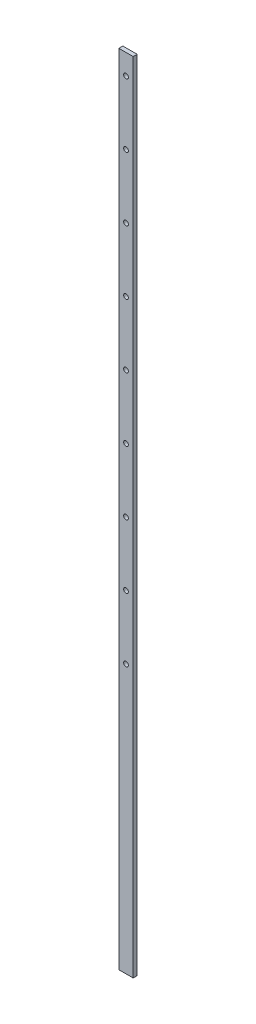
ISO-10303-21;
HEADER;
FILE_DESCRIPTION(('STEP AP214'),'2;1');
FILE_NAME('part.step','',(''),(''),'','','');
FILE_SCHEMA(('AUTOMOTIVE_DESIGN { 1 0 10303 214 1 1 1 1 }'));
ENDSEC;
DATA;
#1=APPLICATION_CONTEXT('core data for automotive mechanical design processes');
#2=APPLICATION_PROTOCOL_DEFINITION('international standard','automotive_design',2000,#1);
#3=PRODUCT_CONTEXT('',#1,'mechanical');
#4=PRODUCT('Part','Part','',(#3));
#5=PRODUCT_RELATED_PRODUCT_CATEGORY('part','',(#4));
#6=PRODUCT_DEFINITION_FORMATION('','',#4);
#7=PRODUCT_DEFINITION_CONTEXT('part definition',#1,'design');
#8=PRODUCT_DEFINITION('design','',#6,#7);
#9=PRODUCT_DEFINITION_SHAPE('','',#8);
#10=(LENGTH_UNIT() NAMED_UNIT(*) SI_UNIT(.MILLI.,.METRE.));
#11=(NAMED_UNIT(*) PLANE_ANGLE_UNIT() SI_UNIT($,.RADIAN.));
#12=(NAMED_UNIT(*) SI_UNIT($,.STERADIAN.) SOLID_ANGLE_UNIT());
#13=UNCERTAINTY_MEASURE_WITH_UNIT(LENGTH_MEASURE(1.E-05),#10,'distance_accuracy_value','');
#14=(GEOMETRIC_REPRESENTATION_CONTEXT(3) GLOBAL_UNCERTAINTY_ASSIGNED_CONTEXT((#13)) GLOBAL_UNIT_ASSIGNED_CONTEXT((#10,
#11,#12)) REPRESENTATION_CONTEXT('',''));
#15=CARTESIAN_POINT('',(0.,0.,0.));
#16=DIRECTION('',(0.,0.,1.));
#17=DIRECTION('',(1.,0.,0.));
#18=AXIS2_PLACEMENT_3D('',#15,#16,#17);
#19=CARTESIAN_POINT('',(0.,-164.18,-1.11022302462516E-13));
#20=DIRECTION('',(0.,0.,1.));
#21=DIRECTION('',(1.,0.,0.));
#22=AXIS2_PLACEMENT_3D('',#19,#20,#21);
#23=CYLINDRICAL_SURFACE('',#22,3.);
#24=CARTESIAN_POINT('',(0.,-164.18,-1.11022302462516E-13));
#25=DIRECTION('',(0.,0.,1.));
#26=DIRECTION('',(1.,0.,0.));
#27=AXIS2_PLACEMENT_3D('',#24,#25,#26);
#28=CIRCLE('',#27,3.);
#29=CARTESIAN_POINT('',(3.00000000000001,-164.18,-1.11001485780804E-13));
#30=VERTEX_POINT('',#29);
#31=EDGE_CURVE('E49',#30,#30,#28,.T.);
#32=ORIENTED_EDGE('',*,*,#31,.F.);
#33=EDGE_LOOP('',(#32));
#34=FACE_BOUND('',#33,.T.);
#35=CARTESIAN_POINT('',(0.,-164.18,4.99999999999989));
#36=DIRECTION('',(0.,0.,1.));
#37=DIRECTION('',(1.,0.,0.));
#38=AXIS2_PLACEMENT_3D('',#35,#36,#37);
#39=CIRCLE('',#38,3.);
#40=CARTESIAN_POINT('',(3.,-164.18,4.99999999999989));
#41=VERTEX_POINT('',#40);
#42=EDGE_CURVE('E11',#41,#41,#39,.T.);
#43=ORIENTED_EDGE('',*,*,#42,.T.);
#44=EDGE_LOOP('',(#43));
#45=FACE_BOUND('',#44,.T.);
#46=ADVANCED_FACE('F40',(#34,#45),#23,.F.);
#47=CARTESIAN_POINT('',(0.,-84.18,-1.11022302462516E-13));
#48=DIRECTION('',(0.,0.,1.));
#49=DIRECTION('',(1.,0.,0.));
#50=AXIS2_PLACEMENT_3D('',#47,#48,#49);
#51=CYLINDRICAL_SURFACE('',#50,3.);
#52=CARTESIAN_POINT('',(0.,-84.18,-1.11022302462516E-13));
#53=DIRECTION('',(0.,0.,1.));
#54=DIRECTION('',(1.,0.,0.));
#55=AXIS2_PLACEMENT_3D('',#52,#53,#54);
#56=CIRCLE('',#55,3.);
#57=CARTESIAN_POINT('',(3.,-84.18,-1.11001485780804E-13));
#58=VERTEX_POINT('',#57);
#59=EDGE_CURVE('E171',#58,#58,#56,.T.);
#60=ORIENTED_EDGE('',*,*,#59,.F.);
#61=EDGE_LOOP('',(#60));
#62=FACE_BOUND('',#61,.T.);
#63=CARTESIAN_POINT('',(0.,-84.18,4.99999999999995));
#64=DIRECTION('',(0.,0.,1.));
#65=DIRECTION('',(1.,0.,0.));
#66=AXIS2_PLACEMENT_3D('',#63,#64,#65);
#67=CIRCLE('',#66,3.);
#68=CARTESIAN_POINT('',(3.,-84.18,4.99999999999995));
#69=VERTEX_POINT('',#68);
#70=EDGE_CURVE('E175',#69,#69,#67,.T.);
#71=ORIENTED_EDGE('',*,*,#70,.T.);
#72=EDGE_LOOP('',(#71));
#73=FACE_BOUND('',#72,.T.);
#74=ADVANCED_FACE('F187',(#62,#73),#51,.F.);
#75=CARTESIAN_POINT('',(0.,-4.17999999999991,0.));
#76=DIRECTION('',(0.,0.,1.));
#77=DIRECTION('',(1.,0.,0.));
#78=AXIS2_PLACEMENT_3D('',#75,#76,#77);
#79=CYLINDRICAL_SURFACE('',#78,3.);
#80=CARTESIAN_POINT('',(0.,-4.17999999999991,0.));
#81=DIRECTION('',(0.,0.,1.));
#82=DIRECTION('',(1.,0.,0.));
#83=AXIS2_PLACEMENT_3D('',#80,#81,#82);
#84=CIRCLE('',#83,3.);
#85=CARTESIAN_POINT('',(3.,-4.17999999999991,0.));
#86=VERTEX_POINT('',#85);
#87=EDGE_CURVE('E163',#86,#86,#84,.T.);
#88=ORIENTED_EDGE('',*,*,#87,.F.);
#89=EDGE_LOOP('',(#88));
#90=FACE_BOUND('',#89,.T.);
#91=CARTESIAN_POINT('',(0.,-4.17999999999996,4.99999999999989));
#92=DIRECTION('',(0.,0.,1.));
#93=DIRECTION('',(1.,0.,0.));
#94=AXIS2_PLACEMENT_3D('',#91,#92,#93);
#95=CIRCLE('',#94,3.);
#96=CARTESIAN_POINT('',(3.,-4.17999999999996,4.99999999999989));
#97=VERTEX_POINT('',#96);
#98=EDGE_CURVE('E167',#97,#97,#95,.T.);
#99=ORIENTED_EDGE('',*,*,#98,.T.);
#100=EDGE_LOOP('',(#99));
#101=FACE_BOUND('',#100,.T.);
#102=ADVANCED_FACE('F230',(#90,#101),#79,.F.);
#103=CARTESIAN_POINT('',(0.,75.8200000000003,0.));
#104=DIRECTION('',(0.,0.,1.));
#105=DIRECTION('',(1.,0.,0.));
#106=AXIS2_PLACEMENT_3D('',#103,#104,#105);
#107=CYLINDRICAL_SURFACE('',#106,3.);
#108=CARTESIAN_POINT('',(0.,75.8200000000003,0.));
#109=DIRECTION('',(0.,0.,1.));
#110=DIRECTION('',(1.,0.,0.));
#111=AXIS2_PLACEMENT_3D('',#108,#109,#110);
#112=CIRCLE('',#111,3.);
#113=CARTESIAN_POINT('',(3.,75.8200000000003,0.));
#114=VERTEX_POINT('',#113);
#115=EDGE_CURVE('E155',#114,#114,#112,.T.);
#116=ORIENTED_EDGE('',*,*,#115,.F.);
#117=EDGE_LOOP('',(#116));
#118=FACE_BOUND('',#117,.T.);
#119=CARTESIAN_POINT('',(0.,75.8200000000002,5.00000000000006));
#120=DIRECTION('',(0.,0.,1.));
#121=DIRECTION('',(1.,0.,0.));
#122=AXIS2_PLACEMENT_3D('',#119,#120,#121);
#123=CIRCLE('',#122,3.);
#124=CARTESIAN_POINT('',(3.,75.8200000000002,5.00000000000006));
#125=VERTEX_POINT('',#124);
#126=EDGE_CURVE('E159',#125,#125,#123,.T.);
#127=ORIENTED_EDGE('',*,*,#126,.T.);
#128=EDGE_LOOP('',(#127));
#129=FACE_BOUND('',#128,.T.);
#130=ADVANCED_FACE('F226',(#118,#129),#107,.F.);
#131=CARTESIAN_POINT('',(0.,155.82,0.));
#132=DIRECTION('',(0.,0.,1.));
#133=DIRECTION('',(1.,0.,0.));
#134=AXIS2_PLACEMENT_3D('',#131,#132,#133);
#135=CYLINDRICAL_SURFACE('',#134,3.);
#136=CARTESIAN_POINT('',(0.,155.82,0.));
#137=DIRECTION('',(0.,0.,1.));
#138=DIRECTION('',(1.,0.,0.));
#139=AXIS2_PLACEMENT_3D('',#136,#137,#138);
#140=CIRCLE('',#139,3.);
#141=CARTESIAN_POINT('',(3.,155.82,0.));
#142=VERTEX_POINT('',#141);
#143=EDGE_CURVE('E147',#142,#142,#140,.T.);
#144=ORIENTED_EDGE('',*,*,#143,.F.);
#145=EDGE_LOOP('',(#144));
#146=FACE_BOUND('',#145,.T.);
#147=CARTESIAN_POINT('',(0.,155.82,4.99999999999989));
#148=DIRECTION('',(0.,0.,1.));
#149=DIRECTION('',(1.,0.,0.));
#150=AXIS2_PLACEMENT_3D('',#147,#148,#149);
#151=CIRCLE('',#150,3.);
#152=CARTESIAN_POINT('',(3.,155.82,4.99999999999989));
#153=VERTEX_POINT('',#152);
#154=EDGE_CURVE('E151',#153,#153,#151,.T.);
#155=ORIENTED_EDGE('',*,*,#154,.T.);
#156=EDGE_LOOP('',(#155));
#157=FACE_BOUND('',#156,.T.);
#158=ADVANCED_FACE('F222',(#146,#157),#135,.F.);
#159=CARTESIAN_POINT('',(0.,235.82,1.11022302462516E-13));
#160=DIRECTION('',(0.,0.,1.));
#161=DIRECTION('',(1.,0.,0.));
#162=AXIS2_PLACEMENT_3D('',#159,#160,#161);
#163=CYLINDRICAL_SURFACE('',#162,3.);
#164=CARTESIAN_POINT('',(0.,235.82,1.11022302462516E-13));
#165=DIRECTION('',(0.,0.,1.));
#166=DIRECTION('',(1.,0.,0.));
#167=AXIS2_PLACEMENT_3D('',#164,#165,#166);
#168=CIRCLE('',#167,3.);
#169=CARTESIAN_POINT('',(3.,235.82,1.11043119144227E-13));
#170=VERTEX_POINT('',#169);
#171=EDGE_CURVE('E139',#170,#170,#168,.T.);
#172=ORIENTED_EDGE('',*,*,#171,.F.);
#173=EDGE_LOOP('',(#172));
#174=FACE_BOUND('',#173,.T.);
#175=CARTESIAN_POINT('',(0.,235.82,4.99999999999995));
#176=DIRECTION('',(0.,0.,1.));
#177=DIRECTION('',(1.,0.,0.));
#178=AXIS2_PLACEMENT_3D('',#175,#176,#177);
#179=CIRCLE('',#178,3.);
#180=CARTESIAN_POINT('',(3.,235.82,4.99999999999995));
#181=VERTEX_POINT('',#180);
#182=EDGE_CURVE('E143',#181,#181,#179,.T.);
#183=ORIENTED_EDGE('',*,*,#182,.T.);
#184=EDGE_LOOP('',(#183));
#185=FACE_BOUND('',#184,.T.);
#186=ADVANCED_FACE('F218',(#174,#185),#163,.F.);
#187=CARTESIAN_POINT('',(0.,315.82,-1.11022302462516E-13));
#188=DIRECTION('',(0.,0.,1.));
#189=DIRECTION('',(1.,0.,0.));
#190=AXIS2_PLACEMENT_3D('',#187,#188,#189);
#191=CYLINDRICAL_SURFACE('',#190,3.);
#192=CARTESIAN_POINT('',(0.,315.82,-1.11022302462516E-13));
#193=DIRECTION('',(0.,0.,1.));
#194=DIRECTION('',(1.,0.,0.));
#195=AXIS2_PLACEMENT_3D('',#192,#193,#194);
#196=CIRCLE('',#195,3.);
#197=CARTESIAN_POINT('',(3.,315.82,-1.11001485780804E-13));
#198=VERTEX_POINT('',#197);
#199=EDGE_CURVE('E131',#198,#198,#196,.T.);
#200=ORIENTED_EDGE('',*,*,#199,.F.);
#201=EDGE_LOOP('',(#200));
#202=FACE_BOUND('',#201,.T.);
#203=CARTESIAN_POINT('',(0.,315.82,4.99999999999984));
#204=DIRECTION('',(0.,0.,1.));
#205=DIRECTION('',(1.,0.,0.));
#206=AXIS2_PLACEMENT_3D('',#203,#204,#205);
#207=CIRCLE('',#206,3.);
#208=CARTESIAN_POINT('',(3.,315.82,4.99999999999984));
#209=VERTEX_POINT('',#208);
#210=EDGE_CURVE('E135',#209,#209,#207,.T.);
#211=ORIENTED_EDGE('',*,*,#210,.T.);
#212=EDGE_LOOP('',(#211));
#213=FACE_BOUND('',#212,.T.);
#214=ADVANCED_FACE('F214',(#202,#213),#191,.F.);
#215=CARTESIAN_POINT('',(9.,-501.5,5.));
#216=DIRECTION('',(-1.,0.,0.));
#217=DIRECTION('',(0.,0.,1.));
#218=AXIS2_PLACEMENT_3D('',#215,#216,#217);
#219=PLANE('',#218);
#220=DIRECTION('',(0.,1.,0.));
#221=VECTOR('',#220,1.);
#222=CARTESIAN_POINT('',(9.00000000000001,-501.5,0.));
#223=LINE('',#222,#221);
#224=CARTESIAN_POINT('',(9.00000000000001,-501.5,0.));
#225=VERTEX_POINT('',#224);
#226=CARTESIAN_POINT('',(9.,501.5,-1.66533453693773E-13));
#227=VERTEX_POINT('',#226);
#228=EDGE_CURVE('E114',#225,#227,#223,.T.);
#229=ORIENTED_EDGE('',*,*,#228,.T.);
#230=DIRECTION('',(0.,0.,-1.));
#231=VECTOR('',#230,1.);
#232=CARTESIAN_POINT('',(9.,501.5,4.99999999999978));
#233=LINE('',#232,#231);
#234=CARTESIAN_POINT('',(9.,501.5,4.99999999999978));
#235=VERTEX_POINT('',#234);
#236=EDGE_CURVE('E102',#235,#227,#233,.T.);
#237=ORIENTED_EDGE('',*,*,#236,.F.);
#238=DIRECTION('',(0.,1.,0.));
#239=VECTOR('',#238,1.);
#240=CARTESIAN_POINT('',(9.,-501.5,5.));
#241=LINE('',#240,#239);
#242=CARTESIAN_POINT('',(9.,-501.5,5.));
#243=VERTEX_POINT('',#242);
#244=EDGE_CURVE('E94',#243,#235,#241,.T.);
#245=ORIENTED_EDGE('',*,*,#244,.F.);
#246=DIRECTION('',(0.,0.,-1.));
#247=VECTOR('',#246,1.);
#248=CARTESIAN_POINT('',(9.,-501.5,5.));
#249=LINE('',#248,#247);
#250=EDGE_CURVE('E110',#243,#225,#249,.T.);
#251=ORIENTED_EDGE('',*,*,#250,.T.);
#252=EDGE_LOOP('',(#229,#237,#245,#251));
#253=FACE_BOUND('',#252,.T.);
#254=ADVANCED_FACE('F211',(#253),#219,.F.);
#255=CARTESIAN_POINT('',(-9.00000000000001,501.5,4.99999999999978));
#256=DIRECTION('',(0.,-1.,0.));
#257=DIRECTION('',(0.,0.,-1.));
#258=AXIS2_PLACEMENT_3D('',#255,#256,#257);
#259=PLANE('',#258);
#260=DIRECTION('',(-1.,0.,0.));
#261=VECTOR('',#260,1.);
#262=CARTESIAN_POINT('',(-9.00000000000001,501.5,-1.11022302462516E-13));
#263=LINE('',#262,#261);
#264=CARTESIAN_POINT('',(-9.00000000000001,501.5,-1.11022302462516E-13));
#265=VERTEX_POINT('',#264);
#266=EDGE_CURVE('E100',#227,#265,#263,.T.);
#267=ORIENTED_EDGE('',*,*,#266,.T.);
#268=DIRECTION('',(0.,0.,-1.));
#269=VECTOR('',#268,1.);
#270=CARTESIAN_POINT('',(-9.00000000000001,501.5,4.99999999999978));
#271=LINE('',#270,#269);
#272=CARTESIAN_POINT('',(-9.00000000000001,501.5,4.99999999999978));
#273=VERTEX_POINT('',#272);
#274=EDGE_CURVE('E98',#273,#265,#271,.T.);
#275=ORIENTED_EDGE('',*,*,#274,.F.);
#276=DIRECTION('',(-1.,0.,0.));
#277=VECTOR('',#276,1.);
#278=CARTESIAN_POINT('',(-9.00000000000001,501.5,4.99999999999978));
#279=LINE('',#278,#277);
#280=EDGE_CURVE('E88',#235,#273,#279,.T.);
#281=ORIENTED_EDGE('',*,*,#280,.F.);
#282=ORIENTED_EDGE('',*,*,#236,.T.);
#283=EDGE_LOOP('',(#267,#275,#281,#282));
#284=FACE_BOUND('',#283,.T.);
#285=ADVANCED_FACE('F99',(#284),#259,.F.);
#286=CARTESIAN_POINT('',(-9.,-501.5,4.99999999999995));
#287=DIRECTION('',(1.,0.,0.));
#288=DIRECTION('',(0.,0.,-1.));
#289=AXIS2_PLACEMENT_3D('',#286,#287,#288);
#290=PLANE('',#289);
#291=DIRECTION('',(0.,-1.,0.));
#292=VECTOR('',#291,1.);
#293=CARTESIAN_POINT('',(-9.,-501.5,0.));
#294=LINE('',#293,#292);
#295=CARTESIAN_POINT('',(-9.,-501.5,0.));
#296=VERTEX_POINT('',#295);
#297=EDGE_CURVE('E74',#265,#296,#294,.T.);
#298=ORIENTED_EDGE('',*,*,#297,.T.);
#299=DIRECTION('',(0.,0.,-1.));
#300=VECTOR('',#299,1.);
#301=CARTESIAN_POINT('',(-9.,-501.5,4.99999999999995));
#302=LINE('',#301,#300);
#303=CARTESIAN_POINT('',(-9.,-501.5,4.99999999999995));
#304=VERTEX_POINT('',#303);
#305=EDGE_CURVE('E103',#304,#296,#302,.T.);
#306=ORIENTED_EDGE('',*,*,#305,.F.);
#307=DIRECTION('',(0.,-1.,0.));
#308=VECTOR('',#307,1.);
#309=CARTESIAN_POINT('',(-9.,-501.5,4.99999999999995));
#310=LINE('',#309,#308);
#311=EDGE_CURVE('E92',#273,#304,#310,.T.);
#312=ORIENTED_EDGE('',*,*,#311,.F.);
#313=ORIENTED_EDGE('',*,*,#274,.T.);
#314=EDGE_LOOP('',(#298,#306,#312,#313));
#315=FACE_BOUND('',#314,.T.);
#316=ADVANCED_FACE('F105',(#315),#290,.F.);
#317=CARTESIAN_POINT('',(-9.,-501.5,4.99999999999995));
#318=DIRECTION('',(0.,1.,0.));
#319=DIRECTION('',(0.,0.,1.));
#320=AXIS2_PLACEMENT_3D('',#317,#318,#319);
#321=PLANE('',#320);
#322=DIRECTION('',(1.,0.,0.));
#323=VECTOR('',#322,1.);
#324=CARTESIAN_POINT('',(-9.,-501.5,0.));
#325=LINE('',#324,#323);
#326=EDGE_CURVE('E80',#296,#225,#325,.T.);
#327=ORIENTED_EDGE('',*,*,#326,.T.);
#328=ORIENTED_EDGE('',*,*,#250,.F.);
#329=DIRECTION('',(1.,0.,0.));
#330=VECTOR('',#329,1.);
#331=CARTESIAN_POINT('',(-9.,-501.5,4.99999999999995));
#332=LINE('',#331,#330);
#333=EDGE_CURVE('E57',#304,#243,#332,.T.);
#334=ORIENTED_EDGE('',*,*,#333,.F.);
#335=ORIENTED_EDGE('',*,*,#305,.T.);
#336=EDGE_LOOP('',(#327,#328,#334,#335));
#337=FACE_BOUND('',#336,.T.);
#338=ADVANCED_FACE('F191',(#337),#321,.F.);
#339=CARTESIAN_POINT('',(0.,0.,4.99999999999995));
#340=DIRECTION('',(0.,0.,-1.));
#341=DIRECTION('',(-1.,0.,0.));
#342=AXIS2_PLACEMENT_3D('',#339,#340,#341);
#343=PLANE('',#342);
#344=CARTESIAN_POINT('',(0.,395.82,4.99999999999984));
#345=DIRECTION('',(0.,0.,1.));
#346=DIRECTION('',(1.,0.,0.));
#347=AXIS2_PLACEMENT_3D('',#344,#345,#346);
#348=CIRCLE('',#347,3.);
#349=CARTESIAN_POINT('',(3.,395.82,4.99999999999984));
#350=VERTEX_POINT('',#349);
#351=EDGE_CURVE('E369',#350,#350,#348,.T.);
#352=ORIENTED_EDGE('',*,*,#351,.F.);
#353=EDGE_LOOP('',(#352));
#354=FACE_BOUND('',#353,.T.);
#355=CARTESIAN_POINT('',(0.,475.82,4.99999999999989));
#356=DIRECTION('',(0.,0.,1.));
#357=DIRECTION('',(1.,0.,0.));
#358=AXIS2_PLACEMENT_3D('',#355,#356,#357);
#359=CIRCLE('',#358,3.);
#360=CARTESIAN_POINT('',(3.,475.82,4.99999999999989));
#361=VERTEX_POINT('',#360);
#362=EDGE_CURVE('E371',#361,#361,#359,.T.);
#363=ORIENTED_EDGE('',*,*,#362,.F.);
#364=EDGE_LOOP('',(#363));
#365=FACE_BOUND('',#364,.T.);
#366=ORIENTED_EDGE('',*,*,#244,.T.);
#367=ORIENTED_EDGE('',*,*,#280,.T.);
#368=ORIENTED_EDGE('',*,*,#311,.T.);
#369=ORIENTED_EDGE('',*,*,#333,.T.);
#370=EDGE_LOOP('',(#366,#367,#368,#369));
#371=FACE_BOUND('',#370,.T.);
#372=ORIENTED_EDGE('',*,*,#210,.F.);
#373=EDGE_LOOP('',(#372));
#374=FACE_BOUND('',#373,.T.);
#375=ORIENTED_EDGE('',*,*,#182,.F.);
#376=EDGE_LOOP('',(#375));
#377=FACE_BOUND('',#376,.T.);
#378=ORIENTED_EDGE('',*,*,#154,.F.);
#379=EDGE_LOOP('',(#378));
#380=FACE_BOUND('',#379,.T.);
#381=ORIENTED_EDGE('',*,*,#126,.F.);
#382=EDGE_LOOP('',(#381));
#383=FACE_BOUND('',#382,.T.);
#384=ORIENTED_EDGE('',*,*,#98,.F.);
#385=EDGE_LOOP('',(#384));
#386=FACE_BOUND('',#385,.T.);
#387=ORIENTED_EDGE('',*,*,#70,.F.);
#388=EDGE_LOOP('',(#387));
#389=FACE_BOUND('',#388,.T.);
#390=ORIENTED_EDGE('',*,*,#42,.F.);
#391=EDGE_LOOP('',(#390));
#392=FACE_BOUND('',#391,.T.);
#393=ADVANCED_FACE('F89',(#354,#365,#371,#374,#377,#380,#383,#386,#389,#392),#343,.F.);
#394=CARTESIAN_POINT('',(0.,0.,0.));
#395=DIRECTION('',(0.,0.,-1.));
#396=DIRECTION('',(-1.,0.,0.));
#397=AXIS2_PLACEMENT_3D('',#394,#395,#396);
#398=PLANE('',#397);
#399=CARTESIAN_POINT('',(0.,395.82,0.));
#400=DIRECTION('',(0.,0.,1.));
#401=DIRECTION('',(1.,0.,0.));
#402=AXIS2_PLACEMENT_3D('',#399,#400,#401);
#403=CIRCLE('',#402,3.);
#404=CARTESIAN_POINT('',(3.,395.82,0.));
#405=VERTEX_POINT('',#404);
#406=EDGE_CURVE('E367',#405,#405,#403,.T.);
#407=ORIENTED_EDGE('',*,*,#406,.T.);
#408=EDGE_LOOP('',(#407));
#409=FACE_BOUND('',#408,.T.);
#410=CARTESIAN_POINT('',(0.,475.82,0.));
#411=DIRECTION('',(0.,0.,1.));
#412=DIRECTION('',(1.,0.,0.));
#413=AXIS2_PLACEMENT_3D('',#410,#411,#412);
#414=CIRCLE('',#413,3.);
#415=CARTESIAN_POINT('',(3.,475.82,0.));
#416=VERTEX_POINT('',#415);
#417=EDGE_CURVE('E118',#416,#416,#414,.T.);
#418=ORIENTED_EDGE('',*,*,#417,.T.);
#419=EDGE_LOOP('',(#418));
#420=FACE_BOUND('',#419,.T.);
#421=ORIENTED_EDGE('',*,*,#228,.F.);
#422=ORIENTED_EDGE('',*,*,#326,.F.);
#423=ORIENTED_EDGE('',*,*,#297,.F.);
#424=ORIENTED_EDGE('',*,*,#266,.F.);
#425=EDGE_LOOP('',(#421,#422,#423,#424));
#426=FACE_BOUND('',#425,.T.);
#427=ORIENTED_EDGE('',*,*,#199,.T.);
#428=EDGE_LOOP('',(#427));
#429=FACE_BOUND('',#428,.T.);
#430=ORIENTED_EDGE('',*,*,#171,.T.);
#431=EDGE_LOOP('',(#430));
#432=FACE_BOUND('',#431,.T.);
#433=ORIENTED_EDGE('',*,*,#143,.T.);
#434=EDGE_LOOP('',(#433));
#435=FACE_BOUND('',#434,.T.);
#436=ORIENTED_EDGE('',*,*,#115,.T.);
#437=EDGE_LOOP('',(#436));
#438=FACE_BOUND('',#437,.T.);
#439=ORIENTED_EDGE('',*,*,#87,.T.);
#440=EDGE_LOOP('',(#439));
#441=FACE_BOUND('',#440,.T.);
#442=ORIENTED_EDGE('',*,*,#59,.T.);
#443=EDGE_LOOP('',(#442));
#444=FACE_BOUND('',#443,.T.);
#445=ORIENTED_EDGE('',*,*,#31,.T.);
#446=EDGE_LOOP('',(#445));
#447=FACE_BOUND('',#446,.T.);
#448=ADVANCED_FACE('F183',(#409,#420,#426,#429,#432,#435,#438,#441,#444,#447),#398,.T.);
#449=CARTESIAN_POINT('',(0.,475.82,0.));
#450=DIRECTION('',(0.,0.,1.));
#451=DIRECTION('',(1.,0.,0.));
#452=AXIS2_PLACEMENT_3D('',#449,#450,#451);
#453=CYLINDRICAL_SURFACE('',#452,3.);
#454=ORIENTED_EDGE('',*,*,#417,.F.);
#455=EDGE_LOOP('',(#454));
#456=FACE_BOUND('',#455,.T.);
#457=ORIENTED_EDGE('',*,*,#362,.T.);
#458=EDGE_LOOP('',(#457));
#459=FACE_BOUND('',#458,.T.);
#460=ADVANCED_FACE('F198',(#456,#459),#453,.F.);
#461=CARTESIAN_POINT('',(0.,395.82,0.));
#462=DIRECTION('',(0.,0.,1.));
#463=DIRECTION('',(1.,0.,0.));
#464=AXIS2_PLACEMENT_3D('',#461,#462,#463);
#465=CYLINDRICAL_SURFACE('',#464,3.);
#466=ORIENTED_EDGE('',*,*,#406,.F.);
#467=EDGE_LOOP('',(#466));
#468=FACE_BOUND('',#467,.T.);
#469=ORIENTED_EDGE('',*,*,#351,.T.);
#470=EDGE_LOOP('',(#469));
#471=FACE_BOUND('',#470,.T.);
#472=ADVANCED_FACE('F300',(#468,#471),#465,.F.);
#473=CLOSED_SHELL('',(#46,#74,#102,#130,#158,#186,#214,#254,#285,#316,#338,#393,#448,#460,#472));
#474=MANIFOLD_SOLID_BREP('B2',#473);
#475=ADVANCED_BREP_SHAPE_REPRESENTATION('',(#18,#474),#14);
#476=SHAPE_DEFINITION_REPRESENTATION(#9,#475);
ENDSEC;
END-ISO-10303-21;
